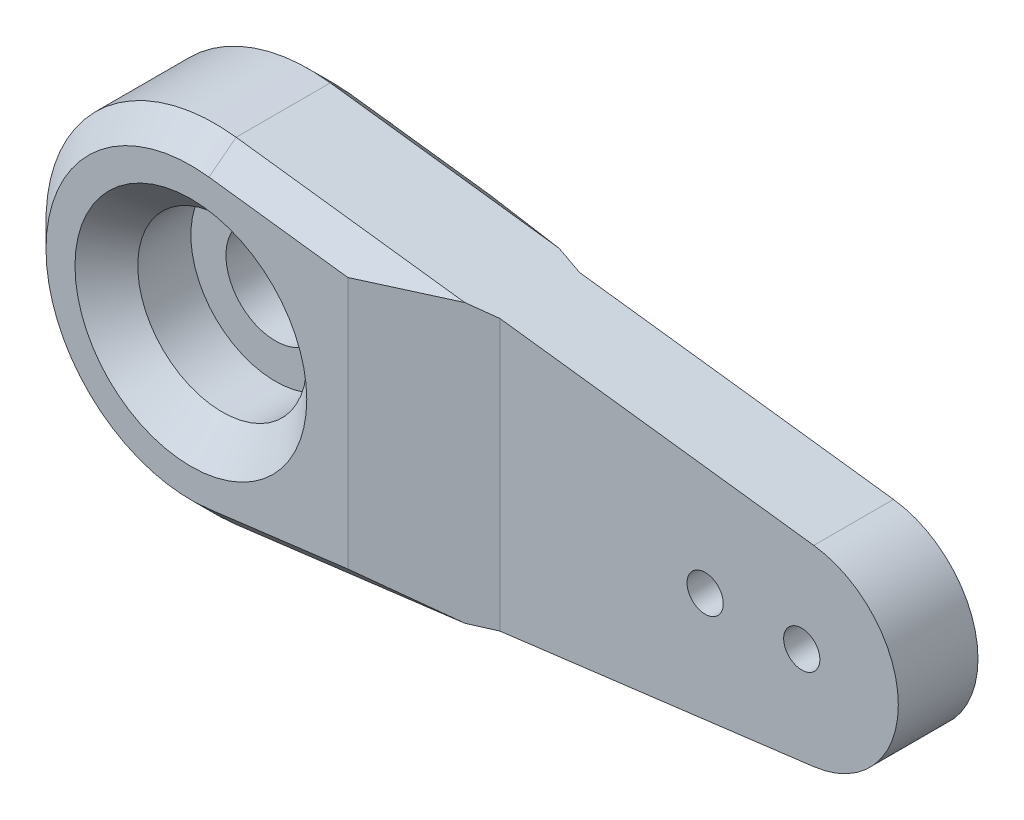
ISO-10303-21;
HEADER;
FILE_DESCRIPTION(('STEP AP214'),'2;1');
FILE_NAME('part.step','',(''),(''),'','','');
FILE_SCHEMA(('AUTOMOTIVE_DESIGN { 1 0 10303 214 1 1 1 1 }'));
ENDSEC;
DATA;
#1=APPLICATION_CONTEXT('core data for automotive mechanical design processes');
#2=APPLICATION_PROTOCOL_DEFINITION('international standard','automotive_design',2000,#1);
#3=PRODUCT_CONTEXT('',#1,'mechanical');
#4=PRODUCT('Part','Part','',(#3));
#5=PRODUCT_RELATED_PRODUCT_CATEGORY('part','',(#4));
#6=PRODUCT_DEFINITION_FORMATION('','',#4);
#7=PRODUCT_DEFINITION_CONTEXT('part definition',#1,'design');
#8=PRODUCT_DEFINITION('design','',#6,#7);
#9=PRODUCT_DEFINITION_SHAPE('','',#8);
#10=(LENGTH_UNIT() NAMED_UNIT(*) SI_UNIT(.MILLI.,.METRE.));
#11=(NAMED_UNIT(*) PLANE_ANGLE_UNIT() SI_UNIT($,.RADIAN.));
#12=(NAMED_UNIT(*) SI_UNIT($,.STERADIAN.) SOLID_ANGLE_UNIT());
#13=UNCERTAINTY_MEASURE_WITH_UNIT(LENGTH_MEASURE(1.E-05),#10,'distance_accuracy_value','');
#14=(GEOMETRIC_REPRESENTATION_CONTEXT(3) GLOBAL_UNCERTAINTY_ASSIGNED_CONTEXT((#13)) GLOBAL_UNIT_ASSIGNED_CONTEXT((#10,
#11,#12)) REPRESENTATION_CONTEXT('',''));
#15=CARTESIAN_POINT('',(0.,0.,0.));
#16=DIRECTION('',(0.,0.,1.));
#17=DIRECTION('',(1.,0.,0.));
#18=AXIS2_PLACEMENT_3D('',#15,#16,#17);
#19=CARTESIAN_POINT('',(0.,0.,3.3));
#20=DIRECTION('',(0.,0.,-1.));
#21=DIRECTION('',(-1.,0.,0.));
#22=AXIS2_PLACEMENT_3D('',#19,#20,#21);
#23=CYLINDRICAL_SURFACE('',#22,2.04677347148356);
#24=CARTESIAN_POINT('',(0.,0.,-1.3));
#25=DIRECTION('',(0.,0.,1.));
#26=DIRECTION('',(1.,0.,0.));
#27=AXIS2_PLACEMENT_3D('',#24,#25,#26);
#28=CIRCLE('',#27,2.04677347148356);
#29=CARTESIAN_POINT('',(2.04677347148356,0.,-1.3));
#30=VERTEX_POINT('',#29);
#31=EDGE_CURVE('E175',#30,#30,#28,.F.);
#32=ORIENTED_EDGE('',*,*,#31,.T.);
#33=EDGE_LOOP('',(#32));
#34=FACE_BOUND('',#33,.T.);
#35=CARTESIAN_POINT('',(0.,0.,1.1));
#36=DIRECTION('',(0.,0.,1.));
#37=DIRECTION('',(1.,0.,0.));
#38=AXIS2_PLACEMENT_3D('',#35,#36,#37);
#39=CIRCLE('',#38,2.04677347148356);
#40=CARTESIAN_POINT('',(2.04677347148356,0.,1.1));
#41=VERTEX_POINT('',#40);
#42=EDGE_CURVE('E282',#41,#41,#39,.T.);
#43=ORIENTED_EDGE('',*,*,#42,.T.);
#44=EDGE_LOOP('',(#43));
#45=FACE_BOUND('',#44,.T.);
#46=ADVANCED_FACE('F41',(#34,#45),#23,.F.);
#47=CARTESIAN_POINT('',(0.,0.,-1.3));
#48=DIRECTION('',(0.,0.,1.));
#49=DIRECTION('',(1.,0.,0.));
#50=AXIS2_PLACEMENT_3D('',#47,#48,#49);
#51=PLANE('',#50);
#52=ORIENTED_EDGE('',*,*,#31,.F.);
#53=EDGE_LOOP('',(#52));
#54=FACE_BOUND('',#53,.T.);
#55=CARTESIAN_POINT('',(0.,0.,-1.3));
#56=DIRECTION('',(0.,0.,-1.));
#57=DIRECTION('',(-1.,0.,0.));
#58=AXIS2_PLACEMENT_3D('',#55,#56,#57);
#59=CIRCLE('',#58,2.75);
#60=CARTESIAN_POINT('',(-2.75,0.,-1.3));
#61=VERTEX_POINT('',#60);
#62=EDGE_CURVE('E286',#61,#61,#59,.T.);
#63=ORIENTED_EDGE('',*,*,#62,.T.);
#64=EDGE_LOOP('',(#63));
#65=FACE_BOUND('',#64,.T.);
#66=ADVANCED_FACE('F327',(#54,#65),#51,.F.);
#67=CARTESIAN_POINT('',(0.,0.,3.3));
#68=DIRECTION('',(0.,0.,1.));
#69=DIRECTION('',(1.,0.,0.));
#70=AXIS2_PLACEMENT_3D('',#67,#68,#69);
#71=PLANE('',#70);
#72=CARTESIAN_POINT('',(20.,0.,3.3));
#73=DIRECTION('',(0.,0.,1.));
#74=DIRECTION('',(1.,0.,0.));
#75=AXIS2_PLACEMENT_3D('',#72,#73,#74);
#76=CIRCLE('',#75,0.750000000000002);
#77=CARTESIAN_POINT('',(20.75,0.,3.3));
#78=VERTEX_POINT('',#77);
#79=EDGE_CURVE('E306',#78,#78,#76,.T.);
#80=ORIENTED_EDGE('',*,*,#79,.F.);
#81=EDGE_LOOP('',(#80));
#82=FACE_BOUND('',#81,.T.);
#83=CARTESIAN_POINT('',(24.,0.,3.3));
#84=DIRECTION('',(0.,0.,1.));
#85=DIRECTION('',(1.,0.,0.));
#86=AXIS2_PLACEMENT_3D('',#83,#84,#85);
#87=CIRCLE('',#86,0.750000000000002);
#88=CARTESIAN_POINT('',(24.75,0.,3.3));
#89=VERTEX_POINT('',#88);
#90=EDGE_CURVE('E293',#89,#89,#87,.T.);
#91=ORIENTED_EDGE('',*,*,#90,.F.);
#92=EDGE_LOOP('',(#91));
#93=FACE_BOUND('',#92,.T.);
#94=DIRECTION('',(-0.992156741649222,0.125,0.));
#95=VECTOR('',#94,1.);
#96=CARTESIAN_POINT('',(0.874999999999999,6.94509719154454,3.3));
#97=LINE('',#96,#95);
#98=CARTESIAN_POINT('',(24.5,3.96862696659688,3.3));
#99=VERTEX_POINT('',#98);
#100=CARTESIAN_POINT('',(11.4999999999999,5.60647301630354,3.3));
#101=VERTEX_POINT('',#100);
#102=EDGE_CURVE('E165',#99,#101,#97,.T.);
#103=ORIENTED_EDGE('',*,*,#102,.T.);
#104=DIRECTION('',(0.,-1.,0.));
#105=VECTOR('',#104,1.);
#106=CARTESIAN_POINT('',(11.4999999999999,-6.23641380465224,3.3));
#107=LINE('',#106,#105);
#108=CARTESIAN_POINT('',(11.4999999999999,-5.60647301630354,3.3));
#109=VERTEX_POINT('',#108);
#110=EDGE_CURVE('E142',#101,#109,#107,.T.);
#111=ORIENTED_EDGE('',*,*,#110,.T.);
#112=DIRECTION('',(0.992156741649222,0.125,0.));
#113=VECTOR('',#112,1.);
#114=CARTESIAN_POINT('',(24.5,-3.96862696659688,3.3));
#115=LINE('',#114,#113);
#116=CARTESIAN_POINT('',(24.5,-3.96862696659688,3.3));
#117=VERTEX_POINT('',#116);
#118=EDGE_CURVE('E134',#109,#117,#115,.T.);
#119=ORIENTED_EDGE('',*,*,#118,.T.);
#120=CARTESIAN_POINT('',(24.,0.,3.3));
#121=DIRECTION('',(0.,0.,1.));
#122=DIRECTION('',(-1.,0.,0.));
#123=AXIS2_PLACEMENT_3D('',#120,#121,#122);
#124=CIRCLE('',#123,3.99999999999999);
#125=EDGE_CURVE('E139',#117,#99,#124,.T.);
#126=ORIENTED_EDGE('',*,*,#125,.T.);
#127=EDGE_LOOP('',(#103,#111,#119,#126));
#128=FACE_BOUND('',#127,.T.);
#129=ADVANCED_FACE('F137',(#82,#93,#128),#71,.T.);
#130=CARTESIAN_POINT('',(0.,0.,0.));
#131=DIRECTION('',(0.,0.,1.));
#132=DIRECTION('',(1.,0.,0.));
#133=AXIS2_PLACEMENT_3D('',#130,#131,#132);
#134=PLANE('',#133);
#135=CARTESIAN_POINT('',(20.,0.,0.));
#136=DIRECTION('',(0.,0.,1.));
#137=DIRECTION('',(1.,0.,0.));
#138=AXIS2_PLACEMENT_3D('',#135,#136,#137);
#139=CIRCLE('',#138,0.750000000000002);
#140=CARTESIAN_POINT('',(20.75,0.,0.));
#141=VERTEX_POINT('',#140);
#142=EDGE_CURVE('E45',#141,#141,#139,.T.);
#143=ORIENTED_EDGE('',*,*,#142,.T.);
#144=EDGE_LOOP('',(#143));
#145=FACE_BOUND('',#144,.T.);
#146=CARTESIAN_POINT('',(24.,0.,0.));
#147=DIRECTION('',(0.,0.,1.));
#148=DIRECTION('',(1.,0.,0.));
#149=AXIS2_PLACEMENT_3D('',#146,#147,#148);
#150=CIRCLE('',#149,0.750000000000002);
#151=CARTESIAN_POINT('',(24.75,0.,0.));
#152=VERTEX_POINT('',#151);
#153=EDGE_CURVE('E290',#152,#152,#150,.T.);
#154=ORIENTED_EDGE('',*,*,#153,.T.);
#155=EDGE_LOOP('',(#154));
#156=FACE_BOUND('',#155,.T.);
#157=DIRECTION('',(0.992156741649222,0.125,0.));
#158=VECTOR('',#157,1.);
#159=CARTESIAN_POINT('',(24.5,-3.96862696659688,0.));
#160=LINE('',#159,#158);
#161=CARTESIAN_POINT('',(11.4999999999999,-5.60647301630354,0.));
#162=VERTEX_POINT('',#161);
#163=CARTESIAN_POINT('',(24.5,-3.96862696659688,0.));
#164=VERTEX_POINT('',#163);
#165=EDGE_CURVE('E154',#162,#164,#160,.T.);
#166=ORIENTED_EDGE('',*,*,#165,.F.);
#167=DIRECTION('',(0.,1.,0.));
#168=VECTOR('',#167,1.);
#169=CARTESIAN_POINT('',(11.4999999999999,0.,0.));
#170=LINE('',#169,#168);
#171=CARTESIAN_POINT('',(11.4999999999999,5.60647301630354,0.));
#172=VERTEX_POINT('',#171);
#173=EDGE_CURVE('E196',#162,#172,#170,.T.);
#174=ORIENTED_EDGE('',*,*,#173,.T.);
#175=DIRECTION('',(-0.992156741649222,0.125,0.));
#176=VECTOR('',#175,1.);
#177=CARTESIAN_POINT('',(0.874999999999999,6.94509719154454,0.));
#178=LINE('',#177,#176);
#179=CARTESIAN_POINT('',(24.5,3.96862696659688,0.));
#180=VERTEX_POINT('',#179);
#181=EDGE_CURVE('E147',#180,#172,#178,.T.);
#182=ORIENTED_EDGE('',*,*,#181,.F.);
#183=CARTESIAN_POINT('',(24.,0.,0.));
#184=DIRECTION('',(0.,0.,1.));
#185=DIRECTION('',(-1.,0.,0.));
#186=AXIS2_PLACEMENT_3D('',#183,#184,#185);
#187=CIRCLE('',#186,3.99999999999999);
#188=EDGE_CURVE('E174',#164,#180,#187,.T.);
#189=ORIENTED_EDGE('',*,*,#188,.F.);
#190=EDGE_LOOP('',(#166,#174,#182,#189));
#191=FACE_BOUND('',#190,.T.);
#192=ADVANCED_FACE('F359',(#145,#156,#191),#134,.F.);
#193=CARTESIAN_POINT('',(0.,0.,3.3));
#194=DIRECTION('',(0.,0.,-1.));
#195=DIRECTION('',(-1.,0.,0.));
#196=AXIS2_PLACEMENT_3D('',#193,#194,#195);
#197=CYLINDRICAL_SURFACE('',#196,6.99999999999999);
#198=DIRECTION('',(0.,0.,-1.));
#199=VECTOR('',#198,1.);
#200=CARTESIAN_POINT('',(0.874999999999999,6.94509719154454,3.3));
#201=LINE('',#200,#199);
#202=CARTESIAN_POINT('',(0.874999999999999,6.94509719154454,3.59999999999999));
#203=VERTEX_POINT('',#202);
#204=CARTESIAN_POINT('',(0.874999999999999,6.94509719154454,-0.299999999999993));
#205=VERTEX_POINT('',#204);
#206=EDGE_CURVE('E168',#203,#205,#201,.T.);
#207=ORIENTED_EDGE('',*,*,#206,.T.);
#208=CARTESIAN_POINT('',(0.,0.,-0.299999999999993));
#209=DIRECTION('',(0.,0.,1.));
#210=DIRECTION('',(1.,0.,0.));
#211=AXIS2_PLACEMENT_3D('',#208,#209,#210);
#212=CIRCLE('',#211,6.99999999999999);
#213=CARTESIAN_POINT('',(0.875,-6.94509719154454,-0.299999999999993));
#214=VERTEX_POINT('',#213);
#215=EDGE_CURVE('E238',#205,#214,#212,.T.);
#216=ORIENTED_EDGE('',*,*,#215,.T.);
#217=DIRECTION('',(0.,0.,-1.));
#218=VECTOR('',#217,1.);
#219=CARTESIAN_POINT('',(0.875,-6.94509719154454,3.3));
#220=LINE('',#219,#218);
#221=CARTESIAN_POINT('',(0.875,-6.94509719154454,3.59999999999999));
#222=VERTEX_POINT('',#221);
#223=EDGE_CURVE('E158',#222,#214,#220,.T.);
#224=ORIENTED_EDGE('',*,*,#223,.F.);
#225=CARTESIAN_POINT('',(0.,0.,3.59999999999999));
#226=DIRECTION('',(0.,0.,1.));
#227=DIRECTION('',(1.,0.,0.));
#228=AXIS2_PLACEMENT_3D('',#225,#226,#227);
#229=CIRCLE('',#228,6.99999999999999);
#230=EDGE_CURVE('E235',#222,#203,#229,.F.);
#231=ORIENTED_EDGE('',*,*,#230,.T.);
#232=EDGE_LOOP('',(#207,#216,#224,#231));
#233=FACE_BOUND('',#232,.T.);
#234=ADVANCED_FACE('F363',(#233),#197,.T.);
#235=CARTESIAN_POINT('',(24.5,-3.96862696659688,3.3));
#236=DIRECTION('',(-0.125,0.992156741649222,0.));
#237=DIRECTION('',(-0.992156741649222,-0.125,0.));
#238=AXIS2_PLACEMENT_3D('',#235,#236,#237);
#239=PLANE('',#238);
#240=ORIENTED_EDGE('',*,*,#223,.T.);
#241=DIRECTION('',(0.992156741649222,0.125,0.));
#242=VECTOR('',#241,1.);
#243=CARTESIAN_POINT('',(24.5,-3.96862696659688,-0.299999999999993));
#244=LINE('',#243,#242);
#245=CARTESIAN_POINT('',(10.3461538461538,-5.75184396746093,-0.299999999999993));
#246=VERTEX_POINT('',#245);
#247=EDGE_CURVE('E220',#214,#246,#244,.T.);
#248=ORIENTED_EDGE('',*,*,#247,.T.);
#249=DIRECTION('',(0.960706989138178,0.121037703621964,0.249783817175929));
#250=VECTOR('',#249,1.);
#251=CARTESIAN_POINT('',(24.4808024752852,-3.97104562736751,3.37500864357422));
#252=LINE('',#251,#250);
#253=EDGE_CURVE('E204',#246,#162,#252,.T.);
#254=ORIENTED_EDGE('',*,*,#253,.T.);
#255=ORIENTED_EDGE('',*,*,#165,.T.);
#256=DIRECTION('',(0.,0.,-1.));
#257=VECTOR('',#256,1.);
#258=CARTESIAN_POINT('',(24.5,-3.96862696659688,3.3));
#259=LINE('',#258,#257);
#260=EDGE_CURVE('E150',#117,#164,#259,.T.);
#261=ORIENTED_EDGE('',*,*,#260,.F.);
#262=ORIENTED_EDGE('',*,*,#118,.F.);
#263=DIRECTION('',(0.960706989138178,0.121037703621964,-0.24978381717593));
#264=VECTOR('',#263,1.);
#265=CARTESIAN_POINT('',(23.6889045808013,-4.07081538415609,0.130884808991609));
#266=LINE('',#265,#264);
#267=CARTESIAN_POINT('',(10.3461538461538,-5.75184396746092,3.59999999999999));
#268=VERTEX_POINT('',#267);
#269=EDGE_CURVE('E193',#109,#268,#266,.F.);
#270=ORIENTED_EDGE('',*,*,#269,.T.);
#271=DIRECTION('',(-0.992156741649222,-0.125,0.));
#272=VECTOR('',#271,1.);
#273=CARTESIAN_POINT('',(0.874999999999999,-6.94509719154454,3.59999999999999));
#274=LINE('',#273,#272);
#275=EDGE_CURVE('E217',#268,#222,#274,.T.);
#276=ORIENTED_EDGE('',*,*,#275,.T.);
#277=EDGE_LOOP('',(#240,#248,#254,#255,#261,#262,#270,#276));
#278=FACE_BOUND('',#277,.T.);
#279=ADVANCED_FACE('F152',(#278),#239,.F.);
#280=CARTESIAN_POINT('',(24.,0.,3.3));
#281=DIRECTION('',(0.,0.,-1.));
#282=DIRECTION('',(-1.,0.,0.));
#283=AXIS2_PLACEMENT_3D('',#280,#281,#282);
#284=CYLINDRICAL_SURFACE('',#283,3.99999999999999);
#285=ORIENTED_EDGE('',*,*,#188,.T.);
#286=DIRECTION('',(0.,0.,-1.));
#287=VECTOR('',#286,1.);
#288=CARTESIAN_POINT('',(24.5,3.96862696659688,3.3));
#289=LINE('',#288,#287);
#290=EDGE_CURVE('E159',#99,#180,#289,.T.);
#291=ORIENTED_EDGE('',*,*,#290,.F.);
#292=ORIENTED_EDGE('',*,*,#125,.F.);
#293=ORIENTED_EDGE('',*,*,#260,.T.);
#294=EDGE_LOOP('',(#285,#291,#292,#293));
#295=FACE_BOUND('',#294,.T.);
#296=ADVANCED_FACE('F161',(#295),#284,.T.);
#297=CARTESIAN_POINT('',(0.874999999999999,6.94509719154454,3.3));
#298=DIRECTION('',(-0.125,-0.992156741649222,0.));
#299=DIRECTION('',(0.992156741649222,-0.125,0.));
#300=AXIS2_PLACEMENT_3D('',#297,#298,#299);
#301=PLANE('',#300);
#302=DIRECTION('',(-0.960706989138178,0.121037703621964,-0.249783817175929));
#303=VECTOR('',#302,1.);
#304=CARTESIAN_POINT('',(2.32981241979058,6.76180805502007,-2.38424877085446));
#305=LINE('',#304,#303);
#306=CARTESIAN_POINT('',(10.3461538461538,5.75184396746093,-0.299999999999993));
#307=VERTEX_POINT('',#306);
#308=EDGE_CURVE('E200',#172,#307,#305,.T.);
#309=ORIENTED_EDGE('',*,*,#308,.T.);
#310=DIRECTION('',(-0.992156741649222,0.125,0.));
#311=VECTOR('',#310,1.);
#312=CARTESIAN_POINT('',(0.874999999999999,6.94509719154454,-0.299999999999993));
#313=LINE('',#312,#311);
#314=EDGE_CURVE('E232',#307,#205,#313,.T.);
#315=ORIENTED_EDGE('',*,*,#314,.T.);
#316=ORIENTED_EDGE('',*,*,#206,.F.);
#317=DIRECTION('',(0.992156741649222,-0.125,0.));
#318=VECTOR('',#317,1.);
#319=CARTESIAN_POINT('',(6.5,6.23641380465224,3.59999999999999));
#320=LINE('',#319,#318);
#321=CARTESIAN_POINT('',(10.3461538461539,5.75184396746092,3.59999999999998));
#322=VERTEX_POINT('',#321);
#323=EDGE_CURVE('E229',#203,#322,#320,.T.);
#324=ORIENTED_EDGE('',*,*,#323,.T.);
#325=DIRECTION('',(-0.960706989138178,0.121037703621964,0.24978381717593));
#326=VECTOR('',#325,1.);
#327=CARTESIAN_POINT('',(1.53791452530664,6.86157781180865,5.89014222342029));
#328=LINE('',#327,#326);
#329=EDGE_CURVE('E190',#322,#101,#328,.F.);
#330=ORIENTED_EDGE('',*,*,#329,.T.);
#331=ORIENTED_EDGE('',*,*,#102,.F.);
#332=ORIENTED_EDGE('',*,*,#290,.T.);
#333=ORIENTED_EDGE('',*,*,#181,.T.);
#334=EDGE_LOOP('',(#309,#315,#316,#324,#330,#331,#332,#333));
#335=FACE_BOUND('',#334,.T.);
#336=ADVANCED_FACE('F365',(#335),#301,.F.);
#337=CARTESIAN_POINT('',(0.,0.,-1.3));
#338=DIRECTION('',(0.,0.,1.));
#339=DIRECTION('',(1.,0.,0.));
#340=AXIS2_PLACEMENT_3D('',#337,#338,#339);
#341=CIRCLE('',#340,5.5);
#342=CARTESIAN_POINT('',(5.5,0.,-1.3));
#343=VERTEX_POINT('',#342);
#344=EDGE_CURVE('E255',#343,#343,#341,.F.);
#345=ORIENTED_EDGE('',*,*,#344,.F.);
#346=EDGE_LOOP('',(#345));
#347=FACE_BOUND('',#346,.T.);
#348=DIRECTION('',(0.,-1.,0.));
#349=VECTOR('',#348,1.);
#350=CARTESIAN_POINT('',(6.5,6.23641380465224,-1.3));
#351=LINE('',#350,#349);
#352=CARTESIAN_POINT('',(6.5,5.2285085432943,-1.3));
#353=VERTEX_POINT('',#352);
#354=CARTESIAN_POINT('',(6.5,-5.2285085432943,-1.3));
#355=VERTEX_POINT('',#354);
#356=EDGE_CURVE('E318',#353,#355,#351,.T.);
#357=ORIENTED_EDGE('',*,*,#356,.T.);
#358=DIRECTION('',(-0.992156741649222,-0.125,0.));
#359=VECTOR('',#358,1.);
#360=CARTESIAN_POINT('',(0.749999999999998,-5.95294044989532,-1.3));
#361=LINE('',#360,#359);
#362=CARTESIAN_POINT('',(0.749999999999999,-5.95294044989532,-1.3));
#363=VERTEX_POINT('',#362);
#364=EDGE_CURVE('E213',#355,#363,#361,.T.);
#365=ORIENTED_EDGE('',*,*,#364,.T.);
#366=CARTESIAN_POINT('',(0.,0.,-1.3));
#367=DIRECTION('',(0.,0.,1.));
#368=DIRECTION('',(1.,0.,0.));
#369=AXIS2_PLACEMENT_3D('',#366,#367,#368);
#370=CIRCLE('',#369,5.99999999999999);
#371=CARTESIAN_POINT('',(0.749999999999998,5.95294044989532,-1.3));
#372=VERTEX_POINT('',#371);
#373=EDGE_CURVE('E207',#363,#372,#370,.F.);
#374=ORIENTED_EDGE('',*,*,#373,.T.);
#375=DIRECTION('',(0.992156741649222,-0.125,0.));
#376=VECTOR('',#375,1.);
#377=CARTESIAN_POINT('',(0.749999999999999,5.95294044989532,-1.3));
#378=LINE('',#377,#376);
#379=EDGE_CURVE('E210',#372,#353,#378,.T.);
#380=ORIENTED_EDGE('',*,*,#379,.T.);
#381=EDGE_LOOP('',(#357,#365,#374,#380));
#382=FACE_BOUND('',#381,.T.);
#383=ADVANCED_FACE('F331',(#347,#382),#51,.F.);
#384=CARTESIAN_POINT('',(0.,0.,4.6));
#385=DIRECTION('',(0.,0.,1.));
#386=DIRECTION('',(1.,0.,0.));
#387=AXIS2_PLACEMENT_3D('',#384,#385,#386);
#388=PLANE('',#387);
#389=CARTESIAN_POINT('',(0.,0.,4.6));
#390=DIRECTION('',(0.,0.,1.));
#391=DIRECTION('',(1.,0.,0.));
#392=AXIS2_PLACEMENT_3D('',#389,#390,#391);
#393=CIRCLE('',#392,4.80000000000001);
#394=CARTESIAN_POINT('',(4.80000000000001,0.,4.6));
#395=VERTEX_POINT('',#394);
#396=EDGE_CURVE('E12',#395,#395,#393,.F.);
#397=ORIENTED_EDGE('',*,*,#396,.T.);
#398=EDGE_LOOP('',(#397));
#399=FACE_BOUND('',#398,.T.);
#400=DIRECTION('',(0.,1.,0.));
#401=VECTOR('',#400,1.);
#402=CARTESIAN_POINT('',(6.5,6.23641380465224,4.6));
#403=LINE('',#402,#401);
#404=CARTESIAN_POINT('',(6.5,-5.22850854329429,4.6));
#405=VERTEX_POINT('',#404);
#406=CARTESIAN_POINT('',(6.5,5.22850854329429,4.6));
#407=VERTEX_POINT('',#406);
#408=EDGE_CURVE('E264',#405,#407,#403,.T.);
#409=ORIENTED_EDGE('',*,*,#408,.T.);
#410=DIRECTION('',(-0.992156741649222,0.125,0.));
#411=VECTOR('',#410,1.);
#412=CARTESIAN_POINT('',(0.749999999999997,5.95294044989531,4.6));
#413=LINE('',#412,#411);
#414=CARTESIAN_POINT('',(0.749999999999997,5.95294044989531,4.6));
#415=VERTEX_POINT('',#414);
#416=EDGE_CURVE('E246',#407,#415,#413,.T.);
#417=ORIENTED_EDGE('',*,*,#416,.T.);
#418=CARTESIAN_POINT('',(0.,0.,4.6));
#419=DIRECTION('',(0.,0.,1.));
#420=DIRECTION('',(1.,0.,0.));
#421=AXIS2_PLACEMENT_3D('',#418,#419,#420);
#422=CIRCLE('',#421,5.99999999999998);
#423=CARTESIAN_POINT('',(0.749999999999998,-5.95294044989531,4.6));
#424=VERTEX_POINT('',#423);
#425=EDGE_CURVE('E59',#415,#424,#422,.T.);
#426=ORIENTED_EDGE('',*,*,#425,.T.);
#427=DIRECTION('',(0.992156741649222,0.125,0.));
#428=VECTOR('',#427,1.);
#429=CARTESIAN_POINT('',(6.375,-5.24425706300301,4.6));
#430=LINE('',#429,#428);
#431=EDGE_CURVE('E243',#424,#405,#430,.T.);
#432=ORIENTED_EDGE('',*,*,#431,.T.);
#433=EDGE_LOOP('',(#409,#417,#426,#432));
#434=FACE_BOUND('',#433,.T.);
#435=ADVANCED_FACE('F380',(#399,#434),#388,.T.);
#436=CARTESIAN_POINT('',(6.5,6.23641380465224,4.6));
#437=DIRECTION('',(0.251633851764954,0.,0.967822506788271));
#438=DIRECTION('',(0.,-1.,0.));
#439=AXIS2_PLACEMENT_3D('',#436,#437,#438);
#440=PLANE('',#439);
#441=ORIENTED_EDGE('',*,*,#329,.F.);
#442=DIRECTION('',(0.959538129190848,0.130561676399479,-0.249479913589624));
#443=VECTOR('',#442,1.);
#444=CARTESIAN_POINT('',(1.29665386436577,4.52050375048003,5.95286999526492));
#445=LINE('',#444,#443);
#446=EDGE_CURVE('E252',#322,#407,#445,.F.);
#447=ORIENTED_EDGE('',*,*,#446,.T.);
#448=ORIENTED_EDGE('',*,*,#408,.F.);
#449=DIRECTION('',(-0.959538129190847,0.130561676399479,0.249479913589624));
#450=VECTOR('',#449,1.);
#451=CARTESIAN_POINT('',(1.29665386436577,-4.52050375048002,5.95286999526492));
#452=LINE('',#451,#450);
#453=EDGE_CURVE('E249',#405,#268,#452,.F.);
#454=ORIENTED_EDGE('',*,*,#453,.T.);
#455=ORIENTED_EDGE('',*,*,#269,.F.);
#456=ORIENTED_EDGE('',*,*,#110,.F.);
#457=EDGE_LOOP('',(#441,#447,#448,#454,#455,#456));
#458=FACE_BOUND('',#457,.T.);
#459=ADVANCED_FACE('F376',(#458),#440,.T.);
#460=CARTESIAN_POINT('',(11.4999999999999,0.,0.));
#461=DIRECTION('',(-0.251633851764954,0.,0.967822506788271));
#462=DIRECTION('',(0.,1.,0.));
#463=AXIS2_PLACEMENT_3D('',#460,#461,#462);
#464=PLANE('',#463);
#465=ORIENTED_EDGE('',*,*,#253,.F.);
#466=DIRECTION('',(0.959538129190848,-0.130561676399479,0.249479913589623));
#467=VECTOR('',#466,1.);
#468=CARTESIAN_POINT('',(1.29665386436577,-4.52050375048003,-2.65286999526491));
#469=LINE('',#468,#467);
#470=EDGE_CURVE('E226',#246,#355,#469,.F.);
#471=ORIENTED_EDGE('',*,*,#470,.T.);
#472=ORIENTED_EDGE('',*,*,#356,.F.);
#473=DIRECTION('',(-0.959538129190848,-0.130561676399479,-0.249479913589623));
#474=VECTOR('',#473,1.);
#475=CARTESIAN_POINT('',(1.29665386436577,4.52050375048003,-2.65286999526491));
#476=LINE('',#475,#474);
#477=EDGE_CURVE('E223',#353,#307,#476,.F.);
#478=ORIENTED_EDGE('',*,*,#477,.T.);
#479=ORIENTED_EDGE('',*,*,#308,.F.);
#480=ORIENTED_EDGE('',*,*,#173,.F.);
#481=EDGE_LOOP('',(#465,#471,#472,#478,#479,#480));
#482=FACE_BOUND('',#481,.T.);
#483=ADVANCED_FACE('F379',(#482),#464,.F.);
#484=CARTESIAN_POINT('',(0.749999999999999,5.95294044989532,-1.3));
#485=DIRECTION('',(-0.0883883476483186,-0.701560760020115,0.707106781186546));
#486=DIRECTION('',(0.992156741649222,-0.125,0.));
#487=AXIS2_PLACEMENT_3D('',#484,#485,#486);
#488=PLANE('',#487);
#489=ORIENTED_EDGE('',*,*,#477,.F.);
#490=ORIENTED_EDGE('',*,*,#379,.F.);
#491=DIRECTION('',(-0.0883883476483183,-0.701560760020113,-0.707106781186549));
#492=VECTOR('',#491,1.);
#493=CARTESIAN_POINT('',(0.874999999999999,6.94509719154454,-0.299999999999993));
#494=LINE('',#493,#492);
#495=EDGE_CURVE('E259',#205,#372,#494,.T.);
#496=ORIENTED_EDGE('',*,*,#495,.F.);
#497=ORIENTED_EDGE('',*,*,#314,.F.);
#498=EDGE_LOOP('',(#489,#490,#496,#497));
#499=FACE_BOUND('',#498,.T.);
#500=ADVANCED_FACE('F384',(#499),#488,.F.);
#501=CARTESIAN_POINT('',(0.,0.,-1.3));
#502=DIRECTION('',(0.,0.,1.));
#503=DIRECTION('',(1.,0.,0.));
#504=AXIS2_PLACEMENT_3D('',#501,#502,#503);
#505=CONICAL_SURFACE('',#504,5.99999999999999,0.785398163397447);
#506=ORIENTED_EDGE('',*,*,#495,.T.);
#507=ORIENTED_EDGE('',*,*,#373,.F.);
#508=DIRECTION('',(-0.0883883476483182,0.701560760020113,-0.707106781186549));
#509=VECTOR('',#508,1.);
#510=CARTESIAN_POINT('',(0.875,-6.94509719154454,-0.299999999999993));
#511=LINE('',#510,#509);
#512=EDGE_CURVE('E256',#214,#363,#511,.T.);
#513=ORIENTED_EDGE('',*,*,#512,.F.);
#514=ORIENTED_EDGE('',*,*,#215,.F.);
#515=EDGE_LOOP('',(#506,#507,#513,#514));
#516=FACE_BOUND('',#515,.T.);
#517=ADVANCED_FACE('F390',(#516),#505,.T.);
#518=CARTESIAN_POINT('',(0.749999999999998,-5.95294044989532,-1.3));
#519=DIRECTION('',(-0.0883883476483185,0.701560760020115,0.707106781186546));
#520=DIRECTION('',(-0.992156741649222,-0.125,0.));
#521=AXIS2_PLACEMENT_3D('',#518,#519,#520);
#522=PLANE('',#521);
#523=ORIENTED_EDGE('',*,*,#470,.F.);
#524=ORIENTED_EDGE('',*,*,#247,.F.);
#525=ORIENTED_EDGE('',*,*,#512,.T.);
#526=ORIENTED_EDGE('',*,*,#364,.F.);
#527=EDGE_LOOP('',(#523,#524,#525,#526));
#528=FACE_BOUND('',#527,.T.);
#529=ADVANCED_FACE('F386',(#528),#522,.F.);
#530=CARTESIAN_POINT('',(0.749999999999997,-5.95294044989531,4.6));
#531=DIRECTION('',(0.0883883476483185,-0.701560760020115,0.707106781186547));
#532=DIRECTION('',(-0.992156741649222,-0.125,0.));
#533=AXIS2_PLACEMENT_3D('',#530,#531,#532);
#534=PLANE('',#533);
#535=ORIENTED_EDGE('',*,*,#453,.F.);
#536=ORIENTED_EDGE('',*,*,#431,.F.);
#537=DIRECTION('',(-0.0883883476483183,0.701560760020113,0.707106781186548));
#538=VECTOR('',#537,1.);
#539=CARTESIAN_POINT('',(0.875,-6.94509719154454,3.59999999999999));
#540=LINE('',#539,#538);
#541=EDGE_CURVE('E260',#222,#424,#540,.T.);
#542=ORIENTED_EDGE('',*,*,#541,.F.);
#543=ORIENTED_EDGE('',*,*,#275,.F.);
#544=EDGE_LOOP('',(#535,#536,#542,#543));
#545=FACE_BOUND('',#544,.T.);
#546=ADVANCED_FACE('F389',(#545),#534,.T.);
#547=CARTESIAN_POINT('',(0.,0.,4.6));
#548=DIRECTION('',(0.,0.,-1.));
#549=DIRECTION('',(-1.,0.,0.));
#550=AXIS2_PLACEMENT_3D('',#547,#548,#549);
#551=CONICAL_SURFACE('',#550,5.99999999999998,0.785398163397447);
#552=ORIENTED_EDGE('',*,*,#541,.T.);
#553=ORIENTED_EDGE('',*,*,#425,.F.);
#554=DIRECTION('',(-0.0883883476483182,-0.701560760020112,0.707106781186549));
#555=VECTOR('',#554,1.);
#556=CARTESIAN_POINT('',(0.874999999999999,6.94509719154454,3.59999999999999));
#557=LINE('',#556,#555);
#558=EDGE_CURVE('E67',#203,#415,#557,.T.);
#559=ORIENTED_EDGE('',*,*,#558,.F.);
#560=ORIENTED_EDGE('',*,*,#230,.F.);
#561=EDGE_LOOP('',(#552,#553,#559,#560));
#562=FACE_BOUND('',#561,.T.);
#563=ADVANCED_FACE('F401',(#562),#551,.T.);
#564=CARTESIAN_POINT('',(0.749999999999998,5.95294044989531,4.6));
#565=DIRECTION('',(0.0883883476483186,0.701560760020115,0.707106781186546));
#566=DIRECTION('',(0.992156741649222,-0.125,0.));
#567=AXIS2_PLACEMENT_3D('',#564,#565,#566);
#568=PLANE('',#567);
#569=ORIENTED_EDGE('',*,*,#446,.F.);
#570=ORIENTED_EDGE('',*,*,#323,.F.);
#571=ORIENTED_EDGE('',*,*,#558,.T.);
#572=ORIENTED_EDGE('',*,*,#416,.F.);
#573=EDGE_LOOP('',(#569,#570,#571,#572));
#574=FACE_BOUND('',#573,.T.);
#575=ADVANCED_FACE('F398',(#574),#568,.T.);
#576=CARTESIAN_POINT('',(0.,0.,-3.1));
#577=DIRECTION('',(0.,0.,-1.));
#578=DIRECTION('',(-1.,0.,0.));
#579=AXIS2_PLACEMENT_3D('',#576,#577,#578);
#580=PLANE('',#579);
#581=CARTESIAN_POINT('',(0.,0.,-3.1));
#582=DIRECTION('',(0.,0.,-1.));
#583=DIRECTION('',(-1.,0.,0.));
#584=AXIS2_PLACEMENT_3D('',#581,#582,#583);
#585=CIRCLE('',#584,4.);
#586=CARTESIAN_POINT('',(-4.,0.,-3.1));
#587=VERTEX_POINT('',#586);
#588=EDGE_CURVE('E274',#587,#587,#585,.T.);
#589=ORIENTED_EDGE('',*,*,#588,.T.);
#590=EDGE_LOOP('',(#589));
#591=FACE_BOUND('',#590,.T.);
#592=CARTESIAN_POINT('',(0.,0.,-3.1));
#593=DIRECTION('',(0.,0.,-1.));
#594=DIRECTION('',(-1.,0.,0.));
#595=AXIS2_PLACEMENT_3D('',#592,#593,#594);
#596=CIRCLE('',#595,2.75);
#597=CARTESIAN_POINT('',(-2.75,0.,-3.1));
#598=VERTEX_POINT('',#597);
#599=EDGE_CURVE('E267',#598,#598,#596,.T.);
#600=ORIENTED_EDGE('',*,*,#599,.F.);
#601=EDGE_LOOP('',(#600));
#602=FACE_BOUND('',#601,.T.);
#603=ADVANCED_FACE('F346',(#591,#602),#580,.T.);
#604=CARTESIAN_POINT('',(0.,0.,-3.1));
#605=DIRECTION('',(0.,0.,1.));
#606=DIRECTION('',(1.,0.,0.));
#607=AXIS2_PLACEMENT_3D('',#604,#605,#606);
#608=CYLINDRICAL_SURFACE('',#607,5.5);
#609=CARTESIAN_POINT('',(0.,0.,-1.6));
#610=DIRECTION('',(0.,0.,-1.));
#611=DIRECTION('',(-1.,0.,0.));
#612=AXIS2_PLACEMENT_3D('',#609,#610,#611);
#613=CIRCLE('',#612,5.5);
#614=CARTESIAN_POINT('',(-5.5,0.,-1.6));
#615=VERTEX_POINT('',#614);
#616=EDGE_CURVE('E278',#615,#615,#613,.F.);
#617=ORIENTED_EDGE('',*,*,#616,.T.);
#618=EDGE_LOOP('',(#617));
#619=FACE_BOUND('',#618,.T.);
#620=ORIENTED_EDGE('',*,*,#344,.T.);
#621=EDGE_LOOP('',(#620));
#622=FACE_BOUND('',#621,.T.);
#623=ADVANCED_FACE('F337',(#619,#622),#608,.T.);
#624=CARTESIAN_POINT('',(0.,0.,-3.1));
#625=DIRECTION('',(0.,0.,1.));
#626=DIRECTION('',(1.,0.,0.));
#627=AXIS2_PLACEMENT_3D('',#624,#625,#626);
#628=CYLINDRICAL_SURFACE('',#627,2.75);
#629=ORIENTED_EDGE('',*,*,#599,.T.);
#630=EDGE_LOOP('',(#629));
#631=FACE_BOUND('',#630,.T.);
#632=ORIENTED_EDGE('',*,*,#62,.F.);
#633=EDGE_LOOP('',(#632));
#634=FACE_BOUND('',#633,.T.);
#635=ADVANCED_FACE('F334',(#631,#634),#628,.F.);
#636=CARTESIAN_POINT('',(0.,0.,-3.1));
#637=DIRECTION('',(0.,0.,1.));
#638=DIRECTION('',(1.,0.,0.));
#639=AXIS2_PLACEMENT_3D('',#636,#637,#638);
#640=CONICAL_SURFACE('',#639,4.,0.785398163397448);
#641=ORIENTED_EDGE('',*,*,#616,.F.);
#642=EDGE_LOOP('',(#641));
#643=FACE_BOUND('',#642,.T.);
#644=ORIENTED_EDGE('',*,*,#588,.F.);
#645=EDGE_LOOP('',(#644));
#646=FACE_BOUND('',#645,.T.);
#647=ADVANCED_FACE('F336',(#643,#646),#640,.T.);
#648=CARTESIAN_POINT('',(0.,0.,1.1));
#649=DIRECTION('',(0.,0.,1.));
#650=DIRECTION('',(1.,0.,0.));
#651=AXIS2_PLACEMENT_3D('',#648,#649,#650);
#652=CYLINDRICAL_SURFACE('',#651,3.5);
#653=CARTESIAN_POINT('',(0.,0.,3.3));
#654=DIRECTION('',(0.,0.,1.));
#655=DIRECTION('',(1.,0.,0.));
#656=AXIS2_PLACEMENT_3D('',#653,#654,#655);
#657=CIRCLE('',#656,3.5);
#658=CARTESIAN_POINT('',(3.5,0.,3.3));
#659=VERTEX_POINT('',#658);
#660=EDGE_CURVE('E51',#659,#659,#657,.T.);
#661=ORIENTED_EDGE('',*,*,#660,.T.);
#662=EDGE_LOOP('',(#661));
#663=FACE_BOUND('',#662,.T.);
#664=CARTESIAN_POINT('',(0.,0.,1.1));
#665=DIRECTION('',(0.,0.,1.));
#666=DIRECTION('',(1.,0.,0.));
#667=AXIS2_PLACEMENT_3D('',#664,#665,#666);
#668=CIRCLE('',#667,3.5);
#669=CARTESIAN_POINT('',(3.5,0.,1.1));
#670=VERTEX_POINT('',#669);
#671=EDGE_CURVE('E287',#670,#670,#668,.T.);
#672=ORIENTED_EDGE('',*,*,#671,.F.);
#673=EDGE_LOOP('',(#672));
#674=FACE_BOUND('',#673,.T.);
#675=ADVANCED_FACE('F344',(#663,#674),#652,.F.);
#676=CARTESIAN_POINT('',(0.,0.,1.1));
#677=DIRECTION('',(0.,0.,1.));
#678=DIRECTION('',(1.,0.,0.));
#679=AXIS2_PLACEMENT_3D('',#676,#677,#678);
#680=PLANE('',#679);
#681=ORIENTED_EDGE('',*,*,#42,.F.);
#682=EDGE_LOOP('',(#681));
#683=FACE_BOUND('',#682,.T.);
#684=ORIENTED_EDGE('',*,*,#671,.T.);
#685=EDGE_LOOP('',(#684));
#686=FACE_BOUND('',#685,.T.);
#687=ADVANCED_FACE('F477',(#683,#686),#680,.T.);
#688=CARTESIAN_POINT('',(0.,0.,3.3));
#689=DIRECTION('',(0.,0.,1.));
#690=DIRECTION('',(1.,0.,0.));
#691=AXIS2_PLACEMENT_3D('',#688,#689,#690);
#692=CONICAL_SURFACE('',#691,3.5,0.785398163397452);
#693=ORIENTED_EDGE('',*,*,#396,.F.);
#694=EDGE_LOOP('',(#693));
#695=FACE_BOUND('',#694,.T.);
#696=ORIENTED_EDGE('',*,*,#660,.F.);
#697=EDGE_LOOP('',(#696));
#698=FACE_BOUND('',#697,.T.);
#699=ADVANCED_FACE('F43',(#695,#698),#692,.F.);
#700=CARTESIAN_POINT('',(24.,0.,-0.2));
#701=DIRECTION('',(0.,0.,1.));
#702=DIRECTION('',(1.,0.,0.));
#703=AXIS2_PLACEMENT_3D('',#700,#701,#702);
#704=CYLINDRICAL_SURFACE('',#703,0.750000000000002);
#705=ORIENTED_EDGE('',*,*,#90,.T.);
#706=EDGE_LOOP('',(#705));
#707=FACE_BOUND('',#706,.T.);
#708=ORIENTED_EDGE('',*,*,#153,.F.);
#709=EDGE_LOOP('',(#708));
#710=FACE_BOUND('',#709,.T.);
#711=ADVANCED_FACE('F503',(#707,#710),#704,.F.);
#712=CARTESIAN_POINT('',(20.,0.,-0.2));
#713=DIRECTION('',(0.,0.,1.));
#714=DIRECTION('',(1.,0.,0.));
#715=AXIS2_PLACEMENT_3D('',#712,#713,#714);
#716=CYLINDRICAL_SURFACE('',#715,0.750000000000002);
#717=ORIENTED_EDGE('',*,*,#79,.T.);
#718=EDGE_LOOP('',(#717));
#719=FACE_BOUND('',#718,.T.);
#720=ORIENTED_EDGE('',*,*,#142,.F.);
#721=EDGE_LOOP('',(#720));
#722=FACE_BOUND('',#721,.T.);
#723=ADVANCED_FACE('F525',(#719,#722),#716,.F.);
#724=CLOSED_SHELL('',(#46,#66,#129,#192,#234,#279,#296,#336,#383,#435,#459,#483,#500,#517,#529,
#546,#563,#575,#603,#623,#635,#647,#675,#687,#699,#711,#723));
#725=MANIFOLD_SOLID_BREP('B2',#724);
#726=ADVANCED_BREP_SHAPE_REPRESENTATION('',(#18,#725),#14);
#727=SHAPE_DEFINITION_REPRESENTATION(#9,#726);
ENDSEC;
END-ISO-10303-21;
